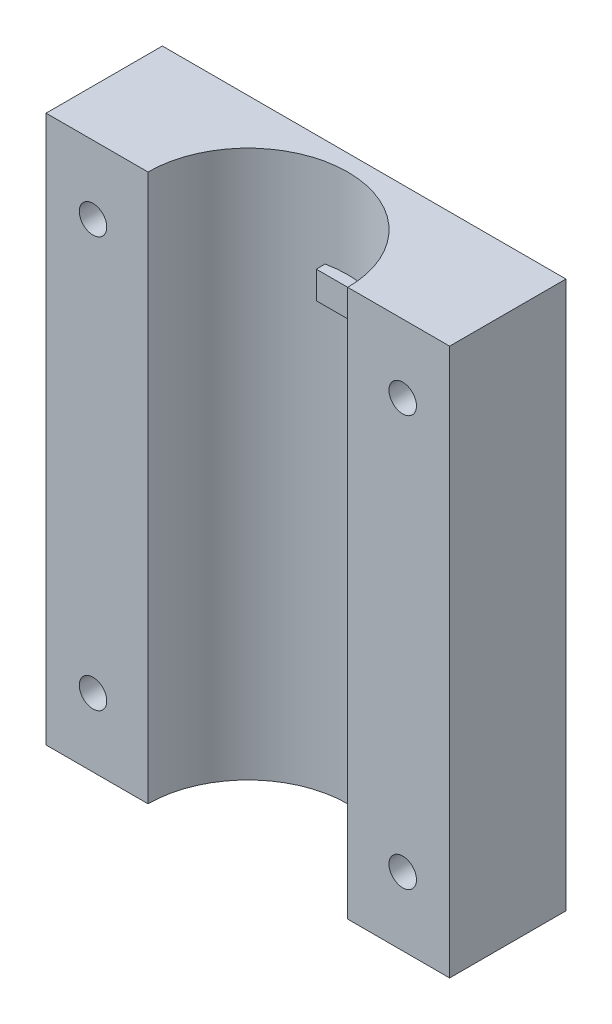
ISO-10303-21;
HEADER;
FILE_DESCRIPTION(('STEP AP214'),'2;1');
FILE_NAME('part.step','',(''),(''),'','','');
FILE_SCHEMA(('AUTOMOTIVE_DESIGN { 1 0 10303 214 1 1 1 1 }'));
ENDSEC;
DATA;
#1=APPLICATION_CONTEXT('core data for automotive mechanical design processes');
#2=APPLICATION_PROTOCOL_DEFINITION('international standard','automotive_design',2000,#1);
#3=PRODUCT_CONTEXT('',#1,'mechanical');
#4=PRODUCT('Part','Part','',(#3));
#5=PRODUCT_RELATED_PRODUCT_CATEGORY('part','',(#4));
#6=PRODUCT_DEFINITION_FORMATION('','',#4);
#7=PRODUCT_DEFINITION_CONTEXT('part definition',#1,'design');
#8=PRODUCT_DEFINITION('design','',#6,#7);
#9=PRODUCT_DEFINITION_SHAPE('','',#8);
#10=(LENGTH_UNIT() NAMED_UNIT(*) SI_UNIT(.MILLI.,.METRE.));
#11=(NAMED_UNIT(*) PLANE_ANGLE_UNIT() SI_UNIT($,.RADIAN.));
#12=(NAMED_UNIT(*) SI_UNIT($,.STERADIAN.) SOLID_ANGLE_UNIT());
#13=UNCERTAINTY_MEASURE_WITH_UNIT(LENGTH_MEASURE(1.E-05),#10,'distance_accuracy_value','');
#14=(GEOMETRIC_REPRESENTATION_CONTEXT(3) GLOBAL_UNCERTAINTY_ASSIGNED_CONTEXT((#13)) GLOBAL_UNIT_ASSIGNED_CONTEXT((#10,
#11,#12)) REPRESENTATION_CONTEXT('',''));
#15=CARTESIAN_POINT('',(0.,0.,0.));
#16=DIRECTION('',(0.,0.,1.));
#17=DIRECTION('',(1.,0.,0.));
#18=AXIS2_PLACEMENT_3D('',#15,#16,#17);
#19=CARTESIAN_POINT('',(0.,0.,0.));
#20=DIRECTION('',(0.,0.,-1.));
#21=DIRECTION('',(-1.,0.,0.));
#22=AXIS2_PLACEMENT_3D('',#19,#20,#21);
#23=PLANE('',#22);
#24=CARTESIAN_POINT('',(28.7528,38.1,0.));
#25=DIRECTION('',(0.,0.,1.));
#26=DIRECTION('',(1.,0.,0.));
#27=AXIS2_PLACEMENT_3D('',#24,#25,#26);
#28=CIRCLE('',#27,2.55269999999999);
#29=CARTESIAN_POINT('',(31.3055,38.1,0.));
#30=VERTEX_POINT('',#29);
#31=EDGE_CURVE('E279',#30,#30,#28,.T.);
#32=ORIENTED_EDGE('',*,*,#31,.F.);
#33=EDGE_LOOP('',(#32));
#34=FACE_BOUND('',#33,.T.);
#35=CARTESIAN_POINT('',(28.7528,-38.1,0.));
#36=DIRECTION('',(0.,0.,1.));
#37=DIRECTION('',(1.,0.,0.));
#38=AXIS2_PLACEMENT_3D('',#35,#36,#37);
#39=CIRCLE('',#38,2.55269999999999);
#40=CARTESIAN_POINT('',(31.3055,-38.1,0.));
#41=VERTEX_POINT('',#40);
#42=EDGE_CURVE('E276',#41,#41,#39,.T.);
#43=ORIENTED_EDGE('',*,*,#42,.F.);
#44=EDGE_LOOP('',(#43));
#45=FACE_BOUND('',#44,.T.);
#46=DIRECTION('',(-1.,0.,0.));
#47=VECTOR('',#46,1.);
#48=CARTESIAN_POINT('',(-37.465,50.8,0.));
#49=LINE('',#48,#47);
#50=CARTESIAN_POINT('',(37.465,50.8,0.));
#51=VERTEX_POINT('',#50);
#52=CARTESIAN_POINT('',(18.542,50.8,0.));
#53=VERTEX_POINT('',#52);
#54=EDGE_CURVE('E173',#51,#53,#49,.T.);
#55=ORIENTED_EDGE('',*,*,#54,.T.);
#56=DIRECTION('',(0.,-1.,0.));
#57=VECTOR('',#56,1.);
#58=CARTESIAN_POINT('',(18.542,337.89368839058,0.));
#59=LINE('',#58,#57);
#60=CARTESIAN_POINT('',(18.542,-50.8,0.));
#61=VERTEX_POINT('',#60);
#62=EDGE_CURVE('E202',#53,#61,#59,.T.);
#63=ORIENTED_EDGE('',*,*,#62,.T.);
#64=DIRECTION('',(1.,0.,0.));
#65=VECTOR('',#64,1.);
#66=CARTESIAN_POINT('',(-37.465,-50.8,0.));
#67=LINE('',#66,#65);
#68=CARTESIAN_POINT('',(37.465,-50.8,0.));
#69=VERTEX_POINT('',#68);
#70=EDGE_CURVE('E181',#61,#69,#67,.T.);
#71=ORIENTED_EDGE('',*,*,#70,.T.);
#72=DIRECTION('',(0.,1.,0.));
#73=VECTOR('',#72,1.);
#74=CARTESIAN_POINT('',(37.465,-50.8,0.));
#75=LINE('',#74,#73);
#76=EDGE_CURVE('E150',#69,#51,#75,.T.);
#77=ORIENTED_EDGE('',*,*,#76,.T.);
#78=EDGE_LOOP('',(#55,#63,#71,#77));
#79=FACE_BOUND('',#78,.T.);
#80=ADVANCED_FACE('F39',(#34,#45,#79),#23,.F.);
#81=CARTESIAN_POINT('',(37.465,-50.8,-21.59));
#82=DIRECTION('',(1.,0.,0.));
#83=DIRECTION('',(0.,0.,-1.));
#84=AXIS2_PLACEMENT_3D('',#81,#82,#83);
#85=PLANE('',#84);
#86=ORIENTED_EDGE('',*,*,#76,.F.);
#87=DIRECTION('',(0.,0.,1.));
#88=VECTOR('',#87,1.);
#89=CARTESIAN_POINT('',(37.465,-50.8,-21.59));
#90=LINE('',#89,#88);
#91=CARTESIAN_POINT('',(37.465,-50.8,-21.59));
#92=VERTEX_POINT('',#91);
#93=EDGE_CURVE('E185',#92,#69,#90,.T.);
#94=ORIENTED_EDGE('',*,*,#93,.F.);
#95=DIRECTION('',(0.,1.,0.));
#96=VECTOR('',#95,1.);
#97=CARTESIAN_POINT('',(37.465,-50.8,-21.59));
#98=LINE('',#97,#96);
#99=CARTESIAN_POINT('',(37.465,50.8,-21.59));
#100=VERTEX_POINT('',#99);
#101=EDGE_CURVE('E151',#92,#100,#98,.T.);
#102=ORIENTED_EDGE('',*,*,#101,.T.);
#103=DIRECTION('',(0.,0.,1.));
#104=VECTOR('',#103,1.);
#105=CARTESIAN_POINT('',(37.465,50.8,-21.59));
#106=LINE('',#105,#104);
#107=EDGE_CURVE('E168',#100,#51,#106,.T.);
#108=ORIENTED_EDGE('',*,*,#107,.T.);
#109=EDGE_LOOP('',(#86,#94,#102,#108));
#110=FACE_BOUND('',#109,.T.);
#111=ADVANCED_FACE('F41',(#110),#85,.T.);
#112=CARTESIAN_POINT('',(-37.465,-50.8,-21.59));
#113=DIRECTION('',(0.,-1.,0.));
#114=DIRECTION('',(0.,0.,-1.));
#115=AXIS2_PLACEMENT_3D('',#112,#113,#114);
#116=PLANE('',#115);
#117=CARTESIAN_POINT('',(0.,-50.8,0.));
#118=DIRECTION('',(0.,-1.,0.));
#119=DIRECTION('',(0.,0.,-1.));
#120=AXIS2_PLACEMENT_3D('',#117,#118,#119);
#121=CIRCLE('',#120,18.542);
#122=CARTESIAN_POINT('',(-18.542,-50.8,0.));
#123=VERTEX_POINT('',#122);
#124=EDGE_CURVE('E143',#123,#61,#121,.T.);
#125=ORIENTED_EDGE('',*,*,#124,.F.);
#126=CARTESIAN_POINT('',(-37.465,-50.8,0.));
#127=VERTEX_POINT('',#126);
#128=EDGE_CURVE('E156',#127,#123,#67,.T.);
#129=ORIENTED_EDGE('',*,*,#128,.F.);
#130=DIRECTION('',(0.,0.,1.));
#131=VECTOR('',#130,1.);
#132=CARTESIAN_POINT('',(-37.465,-50.8,-21.59));
#133=LINE('',#132,#131);
#134=CARTESIAN_POINT('',(-37.465,-50.8,-21.59));
#135=VERTEX_POINT('',#134);
#136=EDGE_CURVE('E190',#135,#127,#133,.T.);
#137=ORIENTED_EDGE('',*,*,#136,.F.);
#138=DIRECTION('',(1.,0.,0.));
#139=VECTOR('',#138,1.);
#140=CARTESIAN_POINT('',(-37.465,-50.8,-21.59));
#141=LINE('',#140,#139);
#142=EDGE_CURVE('E164',#135,#92,#141,.T.);
#143=ORIENTED_EDGE('',*,*,#142,.T.);
#144=ORIENTED_EDGE('',*,*,#93,.T.);
#145=ORIENTED_EDGE('',*,*,#70,.F.);
#146=EDGE_LOOP('',(#125,#129,#137,#143,#144,#145));
#147=FACE_BOUND('',#146,.T.);
#148=ADVANCED_FACE('F229',(#147),#116,.T.);
#149=CARTESIAN_POINT('',(-37.465,-50.8,-21.59));
#150=DIRECTION('',(-1.,0.,0.));
#151=DIRECTION('',(0.,0.,1.));
#152=AXIS2_PLACEMENT_3D('',#149,#150,#151);
#153=PLANE('',#152);
#154=DIRECTION('',(0.,-1.,0.));
#155=VECTOR('',#154,1.);
#156=CARTESIAN_POINT('',(-37.465,-50.8,0.));
#157=LINE('',#156,#155);
#158=CARTESIAN_POINT('',(-37.465,50.8,0.));
#159=VERTEX_POINT('',#158);
#160=EDGE_CURVE('E177',#159,#127,#157,.T.);
#161=ORIENTED_EDGE('',*,*,#160,.F.);
#162=DIRECTION('',(0.,0.,1.));
#163=VECTOR('',#162,1.);
#164=CARTESIAN_POINT('',(-37.465,50.8,-21.59));
#165=LINE('',#164,#163);
#166=CARTESIAN_POINT('',(-37.465,50.8,-21.59));
#167=VERTEX_POINT('',#166);
#168=EDGE_CURVE('E193',#167,#159,#165,.T.);
#169=ORIENTED_EDGE('',*,*,#168,.F.);
#170=DIRECTION('',(0.,-1.,0.));
#171=VECTOR('',#170,1.);
#172=CARTESIAN_POINT('',(-37.465,-50.8,-21.59));
#173=LINE('',#172,#171);
#174=EDGE_CURVE('E160',#167,#135,#173,.T.);
#175=ORIENTED_EDGE('',*,*,#174,.T.);
#176=ORIENTED_EDGE('',*,*,#136,.T.);
#177=EDGE_LOOP('',(#161,#169,#175,#176));
#178=FACE_BOUND('',#177,.T.);
#179=ADVANCED_FACE('F225',(#178),#153,.T.);
#180=CARTESIAN_POINT('',(-37.465,50.8,-21.59));
#181=DIRECTION('',(0.,1.,0.));
#182=DIRECTION('',(0.,0.,1.));
#183=AXIS2_PLACEMENT_3D('',#180,#181,#182);
#184=PLANE('',#183);
#185=CARTESIAN_POINT('',(0.,50.8,0.));
#186=DIRECTION('',(0.,1.,0.));
#187=DIRECTION('',(0.,0.,1.));
#188=AXIS2_PLACEMENT_3D('',#185,#186,#187);
#189=CIRCLE('',#188,18.542);
#190=CARTESIAN_POINT('',(-18.542,50.8,0.));
#191=VERTEX_POINT('',#190);
#192=EDGE_CURVE('E138',#53,#191,#189,.T.);
#193=ORIENTED_EDGE('',*,*,#192,.F.);
#194=ORIENTED_EDGE('',*,*,#54,.F.);
#195=ORIENTED_EDGE('',*,*,#107,.F.);
#196=DIRECTION('',(-1.,0.,0.));
#197=VECTOR('',#196,1.);
#198=CARTESIAN_POINT('',(-37.465,50.8,-21.59));
#199=LINE('',#198,#197);
#200=EDGE_CURVE('E155',#100,#167,#199,.T.);
#201=ORIENTED_EDGE('',*,*,#200,.T.);
#202=ORIENTED_EDGE('',*,*,#168,.T.);
#203=EDGE_CURVE('E172',#191,#159,#49,.T.);
#204=ORIENTED_EDGE('',*,*,#203,.F.);
#205=EDGE_LOOP('',(#193,#194,#195,#201,#202,#204));
#206=FACE_BOUND('',#205,.T.);
#207=ADVANCED_FACE('F221',(#206),#184,.T.);
#208=CARTESIAN_POINT('',(0.,0.,-21.59));
#209=DIRECTION('',(0.,0.,-1.));
#210=DIRECTION('',(-1.,0.,0.));
#211=AXIS2_PLACEMENT_3D('',#208,#209,#210);
#212=PLANE('',#211);
#213=CARTESIAN_POINT('',(-28.7528,38.1,-21.59));
#214=DIRECTION('',(0.,0.,1.));
#215=DIRECTION('',(1.,0.,0.));
#216=AXIS2_PLACEMENT_3D('',#213,#214,#215);
#217=CIRCLE('',#216,2.55269999999999);
#218=CARTESIAN_POINT('',(-26.2001,38.1,-21.59));
#219=VERTEX_POINT('',#218);
#220=EDGE_CURVE('E400',#219,#219,#217,.T.);
#221=ORIENTED_EDGE('',*,*,#220,.T.);
#222=EDGE_LOOP('',(#221));
#223=FACE_BOUND('',#222,.T.);
#224=CARTESIAN_POINT('',(28.7528,38.1,-21.59));
#225=DIRECTION('',(0.,0.,1.));
#226=DIRECTION('',(1.,0.,0.));
#227=AXIS2_PLACEMENT_3D('',#224,#225,#226);
#228=CIRCLE('',#227,2.55269999999999);
#229=CARTESIAN_POINT('',(31.3055,38.1,-21.59));
#230=VERTEX_POINT('',#229);
#231=EDGE_CURVE('E271',#230,#230,#228,.T.);
#232=ORIENTED_EDGE('',*,*,#231,.T.);
#233=EDGE_LOOP('',(#232));
#234=FACE_BOUND('',#233,.T.);
#235=CARTESIAN_POINT('',(-28.7528,-38.1,-21.59));
#236=DIRECTION('',(0.,0.,1.));
#237=DIRECTION('',(1.,0.,0.));
#238=AXIS2_PLACEMENT_3D('',#235,#236,#237);
#239=CIRCLE('',#238,2.55269999999999);
#240=CARTESIAN_POINT('',(-26.2001,-38.1,-21.59));
#241=VERTEX_POINT('',#240);
#242=EDGE_CURVE('E270',#241,#241,#239,.T.);
#243=ORIENTED_EDGE('',*,*,#242,.T.);
#244=EDGE_LOOP('',(#243));
#245=FACE_BOUND('',#244,.T.);
#246=CARTESIAN_POINT('',(28.7528,-38.1,-21.59));
#247=DIRECTION('',(0.,0.,1.));
#248=DIRECTION('',(1.,0.,0.));
#249=AXIS2_PLACEMENT_3D('',#246,#247,#248);
#250=CIRCLE('',#249,2.55269999999999);
#251=CARTESIAN_POINT('',(31.3055,-38.1,-21.59));
#252=VERTEX_POINT('',#251);
#253=EDGE_CURVE('E286',#252,#252,#250,.T.);
#254=ORIENTED_EDGE('',*,*,#253,.T.);
#255=EDGE_LOOP('',(#254));
#256=FACE_BOUND('',#255,.T.);
#257=ORIENTED_EDGE('',*,*,#101,.F.);
#258=ORIENTED_EDGE('',*,*,#142,.F.);
#259=ORIENTED_EDGE('',*,*,#174,.F.);
#260=ORIENTED_EDGE('',*,*,#200,.F.);
#261=EDGE_LOOP('',(#257,#258,#259,#260));
#262=FACE_BOUND('',#261,.T.);
#263=ADVANCED_FACE('F239',(#223,#234,#245,#256,#262),#212,.T.);
#264=CARTESIAN_POINT('',(-28.7528,38.1,0.));
#265=DIRECTION('',(0.,0.,1.));
#266=DIRECTION('',(1.,0.,0.));
#267=AXIS2_PLACEMENT_3D('',#264,#265,#266);
#268=CIRCLE('',#267,2.55269999999999);
#269=CARTESIAN_POINT('',(-26.2001,38.1,0.));
#270=VERTEX_POINT('',#269);
#271=EDGE_CURVE('E264',#270,#270,#268,.T.);
#272=ORIENTED_EDGE('',*,*,#271,.F.);
#273=EDGE_LOOP('',(#272));
#274=FACE_BOUND('',#273,.T.);
#275=CARTESIAN_POINT('',(-28.7528,-38.1,0.));
#276=DIRECTION('',(0.,0.,1.));
#277=DIRECTION('',(1.,0.,0.));
#278=AXIS2_PLACEMENT_3D('',#275,#276,#277);
#279=CIRCLE('',#278,2.55269999999999);
#280=CARTESIAN_POINT('',(-26.2001,-38.1,0.));
#281=VERTEX_POINT('',#280);
#282=EDGE_CURVE('E267',#281,#281,#279,.T.);
#283=ORIENTED_EDGE('',*,*,#282,.F.);
#284=EDGE_LOOP('',(#283));
#285=FACE_BOUND('',#284,.T.);
#286=ORIENTED_EDGE('',*,*,#128,.T.);
#287=DIRECTION('',(0.,-1.,0.));
#288=VECTOR('',#287,1.);
#289=CARTESIAN_POINT('',(-18.542,337.89368839058,0.));
#290=LINE('',#289,#288);
#291=EDGE_CURVE('E189',#123,#191,#290,.F.);
#292=ORIENTED_EDGE('',*,*,#291,.T.);
#293=ORIENTED_EDGE('',*,*,#203,.T.);
#294=ORIENTED_EDGE('',*,*,#160,.T.);
#295=EDGE_LOOP('',(#286,#292,#293,#294));
#296=FACE_BOUND('',#295,.T.);
#297=ADVANCED_FACE('F216',(#274,#285,#296),#23,.F.);
#298=CARTESIAN_POINT('',(0.,337.89368839058,0.));
#299=DIRECTION('',(0.,-1.,0.));
#300=DIRECTION('',(0.,0.,-1.));
#301=AXIS2_PLACEMENT_3D('',#298,#299,#300);
#302=CYLINDRICAL_SURFACE('',#301,18.542);
#303=DIRECTION('',(0.,-1.,0.));
#304=VECTOR('',#303,1.);
#305=CARTESIAN_POINT('',(-3.81,337.89368839058,-18.1463402370836));
#306=LINE('',#305,#304);
#307=CARTESIAN_POINT('',(-3.81,34.29,-18.1463402370836));
#308=VERTEX_POINT('',#307);
#309=CARTESIAN_POINT('',(-3.81,29.21,-18.1463402370836));
#310=VERTEX_POINT('',#309);
#311=EDGE_CURVE('E58',#308,#310,#306,.T.);
#312=ORIENTED_EDGE('',*,*,#311,.F.);
#313=CARTESIAN_POINT('',(0.,34.29,0.));
#314=DIRECTION('',(0.,1.,0.));
#315=DIRECTION('',(0.,0.,1.));
#316=AXIS2_PLACEMENT_3D('',#313,#314,#315);
#317=CIRCLE('',#316,18.542);
#318=CARTESIAN_POINT('',(3.81,34.29,-18.1463402370836));
#319=VERTEX_POINT('',#318);
#320=EDGE_CURVE('E11',#308,#319,#317,.F.);
#321=ORIENTED_EDGE('',*,*,#320,.T.);
#322=DIRECTION('',(0.,-1.,0.));
#323=VECTOR('',#322,1.);
#324=CARTESIAN_POINT('',(3.81,337.89368839058,-18.1463402370836));
#325=LINE('',#324,#323);
#326=CARTESIAN_POINT('',(3.81,29.21,-18.1463402370836));
#327=VERTEX_POINT('',#326);
#328=EDGE_CURVE('E48',#327,#319,#325,.F.);
#329=ORIENTED_EDGE('',*,*,#328,.F.);
#330=CARTESIAN_POINT('',(0.,29.21,0.));
#331=DIRECTION('',(0.,1.,0.));
#332=DIRECTION('',(0.,0.,1.));
#333=AXIS2_PLACEMENT_3D('',#330,#331,#332);
#334=CIRCLE('',#333,18.542);
#335=EDGE_CURVE('E206',#310,#327,#334,.F.);
#336=ORIENTED_EDGE('',*,*,#335,.F.);
#337=EDGE_LOOP('',(#312,#321,#329,#336));
#338=FACE_BOUND('',#337,.T.);
#339=ORIENTED_EDGE('',*,*,#291,.F.);
#340=ORIENTED_EDGE('',*,*,#124,.T.);
#341=ORIENTED_EDGE('',*,*,#62,.F.);
#342=ORIENTED_EDGE('',*,*,#192,.T.);
#343=EDGE_LOOP('',(#339,#340,#341,#342));
#344=FACE_BOUND('',#343,.T.);
#345=ADVANCED_FACE('F232',(#338,#344),#302,.F.);
#346=CARTESIAN_POINT('',(3.81,34.29,-16.51));
#347=DIRECTION('',(-1.,0.,0.));
#348=DIRECTION('',(0.,0.,1.));
#349=AXIS2_PLACEMENT_3D('',#346,#347,#348);
#350=PLANE('',#349);
#351=DIRECTION('',(0.,0.,-1.));
#352=VECTOR('',#351,1.);
#353=CARTESIAN_POINT('',(3.81,29.21,-16.51));
#354=LINE('',#353,#352);
#355=CARTESIAN_POINT('',(3.81,29.21,-16.51));
#356=VERTEX_POINT('',#355);
#357=EDGE_CURVE('E294',#356,#327,#354,.T.);
#358=ORIENTED_EDGE('',*,*,#357,.T.);
#359=ORIENTED_EDGE('',*,*,#328,.T.);
#360=DIRECTION('',(0.,0.,-1.));
#361=VECTOR('',#360,1.);
#362=CARTESIAN_POINT('',(3.81,34.29,-16.51));
#363=LINE('',#362,#361);
#364=CARTESIAN_POINT('',(3.81,34.29,-16.51));
#365=VERTEX_POINT('',#364);
#366=EDGE_CURVE('E113',#365,#319,#363,.T.);
#367=ORIENTED_EDGE('',*,*,#366,.F.);
#368=DIRECTION('',(0.,-1.,0.));
#369=VECTOR('',#368,1.);
#370=CARTESIAN_POINT('',(3.81,34.29,-16.51));
#371=LINE('',#370,#369);
#372=EDGE_CURVE('E118',#365,#356,#371,.T.);
#373=ORIENTED_EDGE('',*,*,#372,.T.);
#374=EDGE_LOOP('',(#358,#359,#367,#373));
#375=FACE_BOUND('',#374,.T.);
#376=ADVANCED_FACE('F116',(#375),#350,.F.);
#377=CARTESIAN_POINT('',(-3.81,34.29,-21.59));
#378=DIRECTION('',(1.,0.,0.));
#379=DIRECTION('',(0.,0.,-1.));
#380=AXIS2_PLACEMENT_3D('',#377,#378,#379);
#381=PLANE('',#380);
#382=DIRECTION('',(0.,0.,1.));
#383=VECTOR('',#382,1.);
#384=CARTESIAN_POINT('',(-3.81,34.29,-21.59));
#385=LINE('',#384,#383);
#386=CARTESIAN_POINT('',(-3.81,34.29,-16.51));
#387=VERTEX_POINT('',#386);
#388=EDGE_CURVE('E122',#308,#387,#385,.T.);
#389=ORIENTED_EDGE('',*,*,#388,.F.);
#390=ORIENTED_EDGE('',*,*,#311,.T.);
#391=DIRECTION('',(0.,0.,1.));
#392=VECTOR('',#391,1.);
#393=CARTESIAN_POINT('',(-3.81,29.21,-21.59));
#394=LINE('',#393,#392);
#395=CARTESIAN_POINT('',(-3.81,29.21,-16.51));
#396=VERTEX_POINT('',#395);
#397=EDGE_CURVE('E132',#310,#396,#394,.T.);
#398=ORIENTED_EDGE('',*,*,#397,.T.);
#399=DIRECTION('',(0.,-1.,0.));
#400=VECTOR('',#399,1.);
#401=CARTESIAN_POINT('',(-3.81,34.29,-16.51));
#402=LINE('',#401,#400);
#403=EDGE_CURVE('E139',#387,#396,#402,.T.);
#404=ORIENTED_EDGE('',*,*,#403,.F.);
#405=EDGE_LOOP('',(#389,#390,#398,#404));
#406=FACE_BOUND('',#405,.T.);
#407=ADVANCED_FACE('F299',(#406),#381,.F.);
#408=CARTESIAN_POINT('',(0.,34.29,0.));
#409=DIRECTION('',(0.,1.,0.));
#410=DIRECTION('',(0.,0.,1.));
#411=AXIS2_PLACEMENT_3D('',#408,#409,#410);
#412=PLANE('',#411);
#413=ORIENTED_EDGE('',*,*,#320,.F.);
#414=ORIENTED_EDGE('',*,*,#388,.T.);
#415=DIRECTION('',(1.,0.,0.));
#416=VECTOR('',#415,1.);
#417=CARTESIAN_POINT('',(-3.81,34.29,-16.51));
#418=LINE('',#417,#416);
#419=EDGE_CURVE('E123',#387,#365,#418,.T.);
#420=ORIENTED_EDGE('',*,*,#419,.T.);
#421=ORIENTED_EDGE('',*,*,#366,.T.);
#422=EDGE_LOOP('',(#413,#414,#420,#421));
#423=FACE_BOUND('',#422,.T.);
#424=ADVANCED_FACE('F126',(#423),#412,.T.);
#425=CARTESIAN_POINT('',(0.,29.21,0.));
#426=DIRECTION('',(0.,1.,0.));
#427=DIRECTION('',(0.,0.,1.));
#428=AXIS2_PLACEMENT_3D('',#425,#426,#427);
#429=PLANE('',#428);
#430=ORIENTED_EDGE('',*,*,#397,.F.);
#431=ORIENTED_EDGE('',*,*,#335,.T.);
#432=ORIENTED_EDGE('',*,*,#357,.F.);
#433=DIRECTION('',(1.,0.,0.));
#434=VECTOR('',#433,1.);
#435=CARTESIAN_POINT('',(-3.81,29.21,-16.51));
#436=LINE('',#435,#434);
#437=EDGE_CURVE('E136',#396,#356,#436,.T.);
#438=ORIENTED_EDGE('',*,*,#437,.F.);
#439=EDGE_LOOP('',(#430,#431,#432,#438));
#440=FACE_BOUND('',#439,.T.);
#441=ADVANCED_FACE('F301',(#440),#429,.F.);
#442=CARTESIAN_POINT('',(-3.81,34.29,-16.51));
#443=DIRECTION('',(0.,0.,-1.));
#444=DIRECTION('',(-1.,0.,0.));
#445=AXIS2_PLACEMENT_3D('',#442,#443,#444);
#446=PLANE('',#445);
#447=ORIENTED_EDGE('',*,*,#437,.T.);
#448=ORIENTED_EDGE('',*,*,#372,.F.);
#449=ORIENTED_EDGE('',*,*,#419,.F.);
#450=ORIENTED_EDGE('',*,*,#403,.T.);
#451=EDGE_LOOP('',(#447,#448,#449,#450));
#452=FACE_BOUND('',#451,.T.);
#453=ADVANCED_FACE('F134',(#452),#446,.F.);
#454=CARTESIAN_POINT('',(28.7528,-38.1,0.));
#455=DIRECTION('',(0.,0.,1.));
#456=DIRECTION('',(1.,0.,0.));
#457=AXIS2_PLACEMENT_3D('',#454,#455,#456);
#458=CYLINDRICAL_SURFACE('',#457,2.55269999999999);
#459=ORIENTED_EDGE('',*,*,#253,.F.);
#460=EDGE_LOOP('',(#459));
#461=FACE_BOUND('',#460,.T.);
#462=ORIENTED_EDGE('',*,*,#42,.T.);
#463=EDGE_LOOP('',(#462));
#464=FACE_BOUND('',#463,.T.);
#465=ADVANCED_FACE('F308',(#461,#464),#458,.F.);
#466=CARTESIAN_POINT('',(-28.7528,-38.1,0.));
#467=DIRECTION('',(0.,0.,1.));
#468=DIRECTION('',(1.,0.,0.));
#469=AXIS2_PLACEMENT_3D('',#466,#467,#468);
#470=CYLINDRICAL_SURFACE('',#469,2.55269999999999);
#471=ORIENTED_EDGE('',*,*,#242,.F.);
#472=EDGE_LOOP('',(#471));
#473=FACE_BOUND('',#472,.T.);
#474=ORIENTED_EDGE('',*,*,#282,.T.);
#475=EDGE_LOOP('',(#474));
#476=FACE_BOUND('',#475,.T.);
#477=ADVANCED_FACE('F364',(#473,#476),#470,.F.);
#478=CARTESIAN_POINT('',(28.7528,38.1,0.));
#479=DIRECTION('',(0.,0.,1.));
#480=DIRECTION('',(1.,0.,0.));
#481=AXIS2_PLACEMENT_3D('',#478,#479,#480);
#482=CYLINDRICAL_SURFACE('',#481,2.55269999999999);
#483=ORIENTED_EDGE('',*,*,#231,.F.);
#484=EDGE_LOOP('',(#483));
#485=FACE_BOUND('',#484,.T.);
#486=ORIENTED_EDGE('',*,*,#31,.T.);
#487=EDGE_LOOP('',(#486));
#488=FACE_BOUND('',#487,.T.);
#489=ADVANCED_FACE('F373',(#485,#488),#482,.F.);
#490=CARTESIAN_POINT('',(-28.7528,38.1,0.));
#491=DIRECTION('',(0.,0.,1.));
#492=DIRECTION('',(1.,0.,0.));
#493=AXIS2_PLACEMENT_3D('',#490,#491,#492);
#494=CYLINDRICAL_SURFACE('',#493,2.55269999999999);
#495=ORIENTED_EDGE('',*,*,#220,.F.);
#496=EDGE_LOOP('',(#495));
#497=FACE_BOUND('',#496,.T.);
#498=ORIENTED_EDGE('',*,*,#271,.T.);
#499=EDGE_LOOP('',(#498));
#500=FACE_BOUND('',#499,.T.);
#501=ADVANCED_FACE('F383',(#497,#500),#494,.F.);
#502=CLOSED_SHELL('',(#80,#111,#148,#179,#207,#263,#297,#345,#376,#407,#424,#441,#453,#465,#477,
#489,#501));
#503=MANIFOLD_SOLID_BREP('B2',#502);
#504=ADVANCED_BREP_SHAPE_REPRESENTATION('',(#18,#503),#14);
#505=SHAPE_DEFINITION_REPRESENTATION(#9,#504);
ENDSEC;
END-ISO-10303-21;
